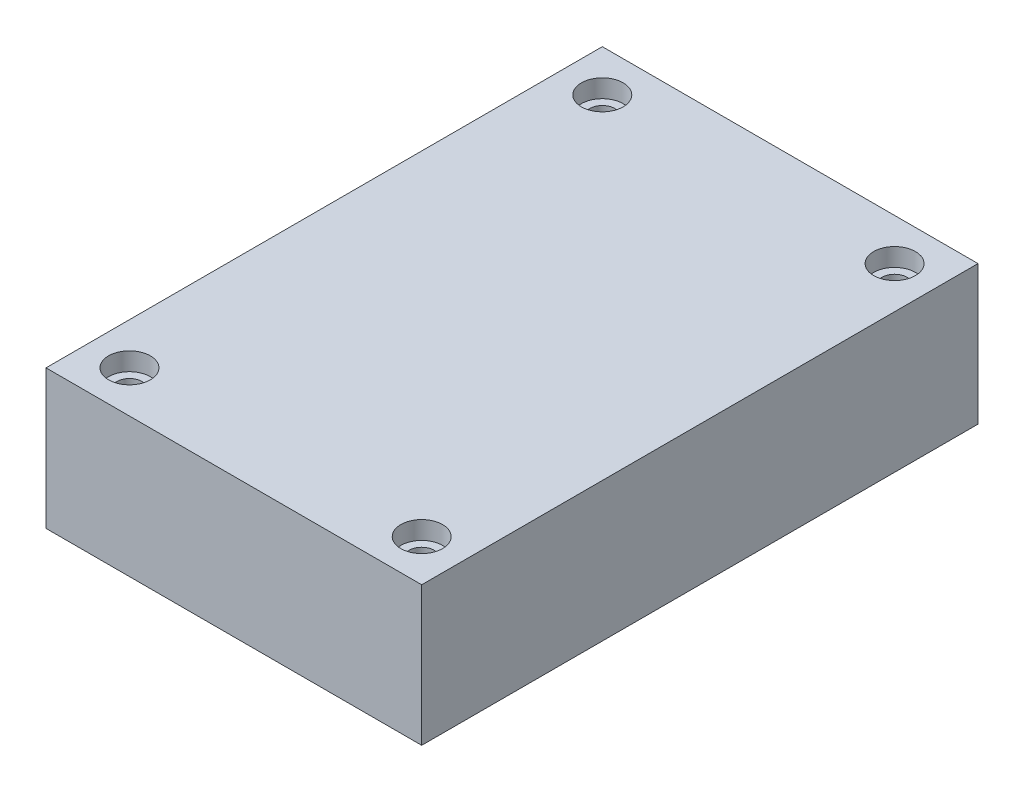
ISO-10303-21;
HEADER;
FILE_DESCRIPTION(('STEP AP214'),'2;1');
FILE_NAME('part.step','',(''),(''),'','','');
FILE_SCHEMA(('AUTOMOTIVE_DESIGN { 1 0 10303 214 1 1 1 1 }'));
ENDSEC;
DATA;
#1=APPLICATION_CONTEXT('core data for automotive mechanical design processes');
#2=APPLICATION_PROTOCOL_DEFINITION('international standard','automotive_design',2000,#1);
#3=PRODUCT_CONTEXT('',#1,'mechanical');
#4=PRODUCT('Part','Part','',(#3));
#5=PRODUCT_RELATED_PRODUCT_CATEGORY('part','',(#4));
#6=PRODUCT_DEFINITION_FORMATION('','',#4);
#7=PRODUCT_DEFINITION_CONTEXT('part definition',#1,'design');
#8=PRODUCT_DEFINITION('design','',#6,#7);
#9=PRODUCT_DEFINITION_SHAPE('','',#8);
#10=(LENGTH_UNIT() NAMED_UNIT(*) SI_UNIT(.MILLI.,.METRE.));
#11=(NAMED_UNIT(*) PLANE_ANGLE_UNIT() SI_UNIT($,.RADIAN.));
#12=(NAMED_UNIT(*) SI_UNIT($,.STERADIAN.) SOLID_ANGLE_UNIT());
#13=UNCERTAINTY_MEASURE_WITH_UNIT(LENGTH_MEASURE(1.E-05),#10,'distance_accuracy_value','');
#14=(GEOMETRIC_REPRESENTATION_CONTEXT(3) GLOBAL_UNCERTAINTY_ASSIGNED_CONTEXT((#13)) GLOBAL_UNIT_ASSIGNED_CONTEXT((#10,
#11,#12)) REPRESENTATION_CONTEXT('',''));
#15=CARTESIAN_POINT('',(0.,0.,0.));
#16=DIRECTION('',(0.,0.,1.));
#17=DIRECTION('',(1.,0.,0.));
#18=AXIS2_PLACEMENT_3D('',#15,#16,#17);
#19=CARTESIAN_POINT('',(67.5347222222222,-25.,200.));
#20=DIRECTION('',(0.,-1.,0.));
#21=DIRECTION('',(1.,0.,0.));
#22=AXIS2_PLACEMENT_3D('',#19,#20,#21);
#23=PLANE('',#22);
#24=CARTESIAN_POINT('',(-52.5347222222222,-25.,15.));
#25=DIRECTION('',(0.,1.,0.));
#26=DIRECTION('',(0.,0.,1.));
#27=AXIS2_PLACEMENT_3D('',#24,#25,#26);
#28=CIRCLE('',#27,4.49999999999999);
#29=CARTESIAN_POINT('',(-52.5347222222222,-25.,19.5));
#30=VERTEX_POINT('',#29);
#31=EDGE_CURVE('E121',#30,#30,#28,.T.);
#32=ORIENTED_EDGE('',*,*,#31,.T.);
#33=EDGE_LOOP('',(#32));
#34=FACE_BOUND('',#33,.T.);
#35=CARTESIAN_POINT('',(52.5347222222222,-25.,15.));
#36=DIRECTION('',(0.,1.,0.));
#37=DIRECTION('',(0.,0.,1.));
#38=AXIS2_PLACEMENT_3D('',#35,#36,#37);
#39=CIRCLE('',#38,4.49999999999999);
#40=CARTESIAN_POINT('',(52.5347222222222,-25.,19.5));
#41=VERTEX_POINT('',#40);
#42=EDGE_CURVE('E125',#41,#41,#39,.T.);
#43=ORIENTED_EDGE('',*,*,#42,.T.);
#44=EDGE_LOOP('',(#43));
#45=FACE_BOUND('',#44,.T.);
#46=CARTESIAN_POINT('',(52.5347222222222,-25.,185.));
#47=DIRECTION('',(0.,1.,0.));
#48=DIRECTION('',(0.,0.,1.));
#49=AXIS2_PLACEMENT_3D('',#46,#47,#48);
#50=CIRCLE('',#49,4.49999999999999);
#51=CARTESIAN_POINT('',(52.5347222222222,-25.,189.5));
#52=VERTEX_POINT('',#51);
#53=EDGE_CURVE('E129',#52,#52,#50,.T.);
#54=ORIENTED_EDGE('',*,*,#53,.T.);
#55=EDGE_LOOP('',(#54));
#56=FACE_BOUND('',#55,.T.);
#57=CARTESIAN_POINT('',(-52.5347222222222,-25.,185.));
#58=DIRECTION('',(0.,1.,0.));
#59=DIRECTION('',(0.,0.,1.));
#60=AXIS2_PLACEMENT_3D('',#57,#58,#59);
#61=CIRCLE('',#60,4.49999999999999);
#62=CARTESIAN_POINT('',(-52.5347222222222,-25.,189.5));
#63=VERTEX_POINT('',#62);
#64=EDGE_CURVE('E105',#63,#63,#61,.T.);
#65=ORIENTED_EDGE('',*,*,#64,.T.);
#66=EDGE_LOOP('',(#65));
#67=FACE_BOUND('',#66,.T.);
#68=DIRECTION('',(-1.,0.,0.));
#69=VECTOR('',#68,1.);
#70=CARTESIAN_POINT('',(67.5347222222222,-25.,0.));
#71=LINE('',#70,#69);
#72=CARTESIAN_POINT('',(67.5347222222222,-25.,0.));
#73=VERTEX_POINT('',#72);
#74=CARTESIAN_POINT('',(-67.5347222222222,-25.,0.));
#75=VERTEX_POINT('',#74);
#76=EDGE_CURVE('E101',#73,#75,#71,.T.);
#77=ORIENTED_EDGE('',*,*,#76,.F.);
#78=DIRECTION('',(0.,0.,-1.));
#79=VECTOR('',#78,1.);
#80=CARTESIAN_POINT('',(67.5347222222222,-25.,200.));
#81=LINE('',#80,#79);
#82=CARTESIAN_POINT('',(67.5347222222222,-25.,200.));
#83=VERTEX_POINT('',#82);
#84=EDGE_CURVE('E11',#83,#73,#81,.T.);
#85=ORIENTED_EDGE('',*,*,#84,.F.);
#86=DIRECTION('',(-1.,0.,0.));
#87=VECTOR('',#86,1.);
#88=CARTESIAN_POINT('',(67.5347222222222,-25.,200.));
#89=LINE('',#88,#87);
#90=CARTESIAN_POINT('',(-67.5347222222222,-25.,200.));
#91=VERTEX_POINT('',#90);
#92=EDGE_CURVE('E95',#83,#91,#89,.T.);
#93=ORIENTED_EDGE('',*,*,#92,.T.);
#94=DIRECTION('',(0.,0.,-1.));
#95=VECTOR('',#94,1.);
#96=CARTESIAN_POINT('',(-67.5347222222222,-25.,200.));
#97=LINE('',#96,#95);
#98=EDGE_CURVE('E38',#91,#75,#97,.T.);
#99=ORIENTED_EDGE('',*,*,#98,.T.);
#100=EDGE_LOOP('',(#77,#85,#93,#99));
#101=FACE_BOUND('',#100,.T.);
#102=ADVANCED_FACE('F35',(#34,#45,#56,#67,#101),#23,.T.);
#103=CARTESIAN_POINT('',(67.5347222222222,-25.,200.));
#104=DIRECTION('',(-1.,0.,0.));
#105=DIRECTION('',(0.,0.,1.));
#106=AXIS2_PLACEMENT_3D('',#103,#104,#105);
#107=PLANE('',#106);
#108=DIRECTION('',(0.,1.,0.));
#109=VECTOR('',#108,1.);
#110=CARTESIAN_POINT('',(67.5347222222222,-25.,0.));
#111=LINE('',#110,#109);
#112=CARTESIAN_POINT('',(67.5347222222222,25.,0.));
#113=VERTEX_POINT('',#112);
#114=EDGE_CURVE('E68',#73,#113,#111,.T.);
#115=ORIENTED_EDGE('',*,*,#114,.T.);
#116=DIRECTION('',(0.,0.,-1.));
#117=VECTOR('',#116,1.);
#118=CARTESIAN_POINT('',(67.5347222222222,25.,200.));
#119=LINE('',#118,#117);
#120=CARTESIAN_POINT('',(67.5347222222222,25.,200.));
#121=VERTEX_POINT('',#120);
#122=EDGE_CURVE('E44',#121,#113,#119,.T.);
#123=ORIENTED_EDGE('',*,*,#122,.F.);
#124=DIRECTION('',(0.,1.,0.));
#125=VECTOR('',#124,1.);
#126=CARTESIAN_POINT('',(67.5347222222222,-25.,200.));
#127=LINE('',#126,#125);
#128=EDGE_CURVE('E85',#83,#121,#127,.T.);
#129=ORIENTED_EDGE('',*,*,#128,.F.);
#130=ORIENTED_EDGE('',*,*,#84,.T.);
#131=EDGE_LOOP('',(#115,#123,#129,#130));
#132=FACE_BOUND('',#131,.T.);
#133=ADVANCED_FACE('F112',(#132),#107,.F.);
#134=CARTESIAN_POINT('',(67.5347222222222,25.,200.));
#135=DIRECTION('',(0.,-1.,0.));
#136=DIRECTION('',(1.,0.,0.));
#137=AXIS2_PLACEMENT_3D('',#134,#135,#136);
#138=PLANE('',#137);
#139=CARTESIAN_POINT('',(-52.5347222222222,25.,15.));
#140=DIRECTION('',(0.,1.,0.));
#141=DIRECTION('',(0.,0.,1.));
#142=AXIS2_PLACEMENT_3D('',#139,#140,#141);
#143=CIRCLE('',#142,7.49999999999999);
#144=CARTESIAN_POINT('',(-52.5347222222222,25.,22.5));
#145=VERTEX_POINT('',#144);
#146=EDGE_CURVE('E170',#145,#145,#143,.T.);
#147=ORIENTED_EDGE('',*,*,#146,.F.);
#148=EDGE_LOOP('',(#147));
#149=FACE_BOUND('',#148,.T.);
#150=CARTESIAN_POINT('',(52.5347222222222,25.,15.));
#151=DIRECTION('',(0.,1.,0.));
#152=DIRECTION('',(0.,0.,1.));
#153=AXIS2_PLACEMENT_3D('',#150,#151,#152);
#154=CIRCLE('',#153,7.49999999999999);
#155=CARTESIAN_POINT('',(52.5347222222222,25.,22.5));
#156=VERTEX_POINT('',#155);
#157=EDGE_CURVE('E160',#156,#156,#154,.T.);
#158=ORIENTED_EDGE('',*,*,#157,.F.);
#159=EDGE_LOOP('',(#158));
#160=FACE_BOUND('',#159,.T.);
#161=CARTESIAN_POINT('',(52.5347222222222,25.,185.));
#162=DIRECTION('',(0.,1.,0.));
#163=DIRECTION('',(0.,0.,1.));
#164=AXIS2_PLACEMENT_3D('',#161,#162,#163);
#165=CIRCLE('',#164,7.49999999999999);
#166=CARTESIAN_POINT('',(52.5347222222222,25.,192.5));
#167=VERTEX_POINT('',#166);
#168=EDGE_CURVE('E150',#167,#167,#165,.T.);
#169=ORIENTED_EDGE('',*,*,#168,.F.);
#170=EDGE_LOOP('',(#169));
#171=FACE_BOUND('',#170,.T.);
#172=CARTESIAN_POINT('',(-52.5347222222222,25.,185.));
#173=DIRECTION('',(0.,1.,0.));
#174=DIRECTION('',(0.,0.,1.));
#175=AXIS2_PLACEMENT_3D('',#172,#173,#174);
#176=CIRCLE('',#175,7.49999999999999);
#177=CARTESIAN_POINT('',(-52.5347222222222,25.,192.5));
#178=VERTEX_POINT('',#177);
#179=EDGE_CURVE('E140',#178,#178,#176,.T.);
#180=ORIENTED_EDGE('',*,*,#179,.F.);
#181=EDGE_LOOP('',(#180));
#182=FACE_BOUND('',#181,.T.);
#183=DIRECTION('',(-1.,0.,0.));
#184=VECTOR('',#183,1.);
#185=CARTESIAN_POINT('',(67.5347222222222,25.,0.));
#186=LINE('',#185,#184);
#187=CARTESIAN_POINT('',(-67.5347222222222,25.,0.));
#188=VERTEX_POINT('',#187);
#189=EDGE_CURVE('E92',#113,#188,#186,.T.);
#190=ORIENTED_EDGE('',*,*,#189,.T.);
#191=DIRECTION('',(0.,0.,-1.));
#192=VECTOR('',#191,1.);
#193=CARTESIAN_POINT('',(-67.5347222222222,25.,200.));
#194=LINE('',#193,#192);
#195=CARTESIAN_POINT('',(-67.5347222222222,25.,200.));
#196=VERTEX_POINT('',#195);
#197=EDGE_CURVE('E89',#196,#188,#194,.T.);
#198=ORIENTED_EDGE('',*,*,#197,.F.);
#199=DIRECTION('',(-1.,0.,0.));
#200=VECTOR('',#199,1.);
#201=CARTESIAN_POINT('',(67.5347222222222,25.,200.));
#202=LINE('',#201,#200);
#203=EDGE_CURVE('E80',#121,#196,#202,.T.);
#204=ORIENTED_EDGE('',*,*,#203,.F.);
#205=ORIENTED_EDGE('',*,*,#122,.T.);
#206=EDGE_LOOP('',(#190,#198,#204,#205));
#207=FACE_BOUND('',#206,.T.);
#208=ADVANCED_FACE('F90',(#149,#160,#171,#182,#207),#138,.F.);
#209=CARTESIAN_POINT('',(-67.5347222222222,-25.,200.));
#210=DIRECTION('',(-1.,0.,0.));
#211=DIRECTION('',(0.,0.,1.));
#212=AXIS2_PLACEMENT_3D('',#209,#210,#211);
#213=PLANE('',#212);
#214=DIRECTION('',(0.,1.,0.));
#215=VECTOR('',#214,1.);
#216=CARTESIAN_POINT('',(-67.5347222222222,-25.,0.));
#217=LINE('',#216,#215);
#218=EDGE_CURVE('E104',#75,#188,#217,.T.);
#219=ORIENTED_EDGE('',*,*,#218,.F.);
#220=ORIENTED_EDGE('',*,*,#98,.F.);
#221=DIRECTION('',(0.,1.,0.));
#222=VECTOR('',#221,1.);
#223=CARTESIAN_POINT('',(-67.5347222222222,-25.,200.));
#224=LINE('',#223,#222);
#225=EDGE_CURVE('E84',#91,#196,#224,.T.);
#226=ORIENTED_EDGE('',*,*,#225,.T.);
#227=ORIENTED_EDGE('',*,*,#197,.T.);
#228=EDGE_LOOP('',(#219,#220,#226,#227));
#229=FACE_BOUND('',#228,.T.);
#230=ADVANCED_FACE('F94',(#229),#213,.T.);
#231=CARTESIAN_POINT('',(0.,0.,200.));
#232=DIRECTION('',(0.,0.,-1.));
#233=DIRECTION('',(-1.,0.,0.));
#234=AXIS2_PLACEMENT_3D('',#231,#232,#233);
#235=PLANE('',#234);
#236=ORIENTED_EDGE('',*,*,#92,.F.);
#237=ORIENTED_EDGE('',*,*,#128,.T.);
#238=ORIENTED_EDGE('',*,*,#203,.T.);
#239=ORIENTED_EDGE('',*,*,#225,.F.);
#240=EDGE_LOOP('',(#236,#237,#238,#239));
#241=FACE_BOUND('',#240,.T.);
#242=ADVANCED_FACE('F83',(#241),#235,.F.);
#243=CARTESIAN_POINT('',(0.,0.,0.));
#244=DIRECTION('',(0.,0.,-1.));
#245=DIRECTION('',(-1.,0.,0.));
#246=AXIS2_PLACEMENT_3D('',#243,#244,#245);
#247=PLANE('',#246);
#248=ORIENTED_EDGE('',*,*,#76,.T.);
#249=ORIENTED_EDGE('',*,*,#218,.T.);
#250=ORIENTED_EDGE('',*,*,#189,.F.);
#251=ORIENTED_EDGE('',*,*,#114,.F.);
#252=EDGE_LOOP('',(#248,#249,#250,#251));
#253=FACE_BOUND('',#252,.T.);
#254=ADVANCED_FACE('F110',(#253),#247,.T.);
#255=CARTESIAN_POINT('',(-52.5347222222222,25.,185.));
#256=DIRECTION('',(0.,1.,0.));
#257=DIRECTION('',(0.,0.,1.));
#258=AXIS2_PLACEMENT_3D('',#255,#256,#257);
#259=CYLINDRICAL_SURFACE('',#258,4.5);
#260=ORIENTED_EDGE('',*,*,#64,.F.);
#261=EDGE_LOOP('',(#260));
#262=FACE_BOUND('',#261,.T.);
#263=CARTESIAN_POINT('',(-52.5347222222222,18.5,185.));
#264=DIRECTION('',(0.,1.,0.));
#265=DIRECTION('',(0.,0.,1.));
#266=AXIS2_PLACEMENT_3D('',#263,#264,#265);
#267=CIRCLE('',#266,4.5);
#268=CARTESIAN_POINT('',(-52.5347222222222,18.5,189.5));
#269=VERTEX_POINT('',#268);
#270=EDGE_CURVE('E133',#269,#269,#267,.T.);
#271=ORIENTED_EDGE('',*,*,#270,.T.);
#272=EDGE_LOOP('',(#271));
#273=FACE_BOUND('',#272,.T.);
#274=ADVANCED_FACE('F198',(#262,#273),#259,.F.);
#275=CARTESIAN_POINT('',(-48.0347222222222,18.5,185.));
#276=DIRECTION('',(0.,-1.,0.));
#277=DIRECTION('',(0.,0.,-1.));
#278=AXIS2_PLACEMENT_3D('',#275,#276,#277);
#279=PLANE('',#278);
#280=ORIENTED_EDGE('',*,*,#270,.F.);
#281=EDGE_LOOP('',(#280));
#282=FACE_BOUND('',#281,.T.);
#283=CARTESIAN_POINT('',(-52.5347222222222,18.5,185.));
#284=DIRECTION('',(0.,1.,0.));
#285=DIRECTION('',(0.,0.,1.));
#286=AXIS2_PLACEMENT_3D('',#283,#284,#285);
#287=CIRCLE('',#286,7.49999999999999);
#288=CARTESIAN_POINT('',(-52.5347222222222,18.5,192.5));
#289=VERTEX_POINT('',#288);
#290=EDGE_CURVE('E135',#289,#289,#287,.T.);
#291=ORIENTED_EDGE('',*,*,#290,.T.);
#292=EDGE_LOOP('',(#291));
#293=FACE_BOUND('',#292,.T.);
#294=ADVANCED_FACE('F188',(#282,#293),#279,.F.);
#295=CARTESIAN_POINT('',(-52.5347222222222,25.,185.));
#296=DIRECTION('',(0.,1.,0.));
#297=DIRECTION('',(0.,0.,1.));
#298=AXIS2_PLACEMENT_3D('',#295,#296,#297);
#299=CYLINDRICAL_SURFACE('',#298,7.49999999999999);
#300=ORIENTED_EDGE('',*,*,#290,.F.);
#301=EDGE_LOOP('',(#300));
#302=FACE_BOUND('',#301,.T.);
#303=ORIENTED_EDGE('',*,*,#179,.T.);
#304=EDGE_LOOP('',(#303));
#305=FACE_BOUND('',#304,.T.);
#306=ADVANCED_FACE('F185',(#302,#305),#299,.F.);
#307=CARTESIAN_POINT('',(52.5347222222222,25.,185.));
#308=DIRECTION('',(0.,1.,0.));
#309=DIRECTION('',(0.,0.,1.));
#310=AXIS2_PLACEMENT_3D('',#307,#308,#309);
#311=CYLINDRICAL_SURFACE('',#310,4.5);
#312=ORIENTED_EDGE('',*,*,#53,.F.);
#313=EDGE_LOOP('',(#312));
#314=FACE_BOUND('',#313,.T.);
#315=CARTESIAN_POINT('',(52.5347222222222,18.5,185.));
#316=DIRECTION('',(0.,1.,0.));
#317=DIRECTION('',(0.,0.,1.));
#318=AXIS2_PLACEMENT_3D('',#315,#316,#317);
#319=CIRCLE('',#318,4.5);
#320=CARTESIAN_POINT('',(52.5347222222222,18.5,189.5));
#321=VERTEX_POINT('',#320);
#322=EDGE_CURVE('E144',#321,#321,#319,.T.);
#323=ORIENTED_EDGE('',*,*,#322,.T.);
#324=EDGE_LOOP('',(#323));
#325=FACE_BOUND('',#324,.T.);
#326=ADVANCED_FACE('F187',(#314,#325),#311,.F.);
#327=CARTESIAN_POINT('',(57.0347222222222,18.5,185.));
#328=DIRECTION('',(0.,-1.,0.));
#329=DIRECTION('',(0.,0.,-1.));
#330=AXIS2_PLACEMENT_3D('',#327,#328,#329);
#331=PLANE('',#330);
#332=ORIENTED_EDGE('',*,*,#322,.F.);
#333=EDGE_LOOP('',(#332));
#334=FACE_BOUND('',#333,.T.);
#335=CARTESIAN_POINT('',(52.5347222222222,18.5,185.));
#336=DIRECTION('',(0.,1.,0.));
#337=DIRECTION('',(0.,0.,1.));
#338=AXIS2_PLACEMENT_3D('',#335,#336,#337);
#339=CIRCLE('',#338,7.49999999999999);
#340=CARTESIAN_POINT('',(52.5347222222222,18.5,192.5));
#341=VERTEX_POINT('',#340);
#342=EDGE_CURVE('E147',#341,#341,#339,.T.);
#343=ORIENTED_EDGE('',*,*,#342,.T.);
#344=EDGE_LOOP('',(#343));
#345=FACE_BOUND('',#344,.T.);
#346=ADVANCED_FACE('F195',(#334,#345),#331,.F.);
#347=CARTESIAN_POINT('',(52.5347222222222,25.,185.));
#348=DIRECTION('',(0.,1.,0.));
#349=DIRECTION('',(0.,0.,1.));
#350=AXIS2_PLACEMENT_3D('',#347,#348,#349);
#351=CYLINDRICAL_SURFACE('',#350,7.49999999999999);
#352=ORIENTED_EDGE('',*,*,#342,.F.);
#353=EDGE_LOOP('',(#352));
#354=FACE_BOUND('',#353,.T.);
#355=ORIENTED_EDGE('',*,*,#168,.T.);
#356=EDGE_LOOP('',(#355));
#357=FACE_BOUND('',#356,.T.);
#358=ADVANCED_FACE('F250',(#354,#357),#351,.F.);
#359=CARTESIAN_POINT('',(52.5347222222222,25.,15.));
#360=DIRECTION('',(0.,1.,0.));
#361=DIRECTION('',(0.,0.,1.));
#362=AXIS2_PLACEMENT_3D('',#359,#360,#361);
#363=CYLINDRICAL_SURFACE('',#362,4.5);
#364=ORIENTED_EDGE('',*,*,#42,.F.);
#365=EDGE_LOOP('',(#364));
#366=FACE_BOUND('',#365,.T.);
#367=CARTESIAN_POINT('',(52.5347222222222,18.5,15.));
#368=DIRECTION('',(0.,1.,0.));
#369=DIRECTION('',(0.,0.,1.));
#370=AXIS2_PLACEMENT_3D('',#367,#368,#369);
#371=CIRCLE('',#370,4.5);
#372=CARTESIAN_POINT('',(52.5347222222222,18.5,19.5));
#373=VERTEX_POINT('',#372);
#374=EDGE_CURVE('E154',#373,#373,#371,.T.);
#375=ORIENTED_EDGE('',*,*,#374,.T.);
#376=EDGE_LOOP('',(#375));
#377=FACE_BOUND('',#376,.T.);
#378=ADVANCED_FACE('F258',(#366,#377),#363,.F.);
#379=CARTESIAN_POINT('',(57.0347222222222,18.5,15.));
#380=DIRECTION('',(0.,-1.,0.));
#381=DIRECTION('',(0.,0.,-1.));
#382=AXIS2_PLACEMENT_3D('',#379,#380,#381);
#383=PLANE('',#382);
#384=ORIENTED_EDGE('',*,*,#374,.F.);
#385=EDGE_LOOP('',(#384));
#386=FACE_BOUND('',#385,.T.);
#387=CARTESIAN_POINT('',(52.5347222222222,18.5,15.));
#388=DIRECTION('',(0.,1.,0.));
#389=DIRECTION('',(0.,0.,1.));
#390=AXIS2_PLACEMENT_3D('',#387,#388,#389);
#391=CIRCLE('',#390,7.49999999999999);
#392=CARTESIAN_POINT('',(52.5347222222222,18.5,22.5));
#393=VERTEX_POINT('',#392);
#394=EDGE_CURVE('E157',#393,#393,#391,.T.);
#395=ORIENTED_EDGE('',*,*,#394,.T.);
#396=EDGE_LOOP('',(#395));
#397=FACE_BOUND('',#396,.T.);
#398=ADVANCED_FACE('F278',(#386,#397),#383,.F.);
#399=CARTESIAN_POINT('',(52.5347222222222,25.,15.));
#400=DIRECTION('',(0.,1.,0.));
#401=DIRECTION('',(0.,0.,1.));
#402=AXIS2_PLACEMENT_3D('',#399,#400,#401);
#403=CYLINDRICAL_SURFACE('',#402,7.49999999999999);
#404=ORIENTED_EDGE('',*,*,#394,.F.);
#405=EDGE_LOOP('',(#404));
#406=FACE_BOUND('',#405,.T.);
#407=ORIENTED_EDGE('',*,*,#157,.T.);
#408=EDGE_LOOP('',(#407));
#409=FACE_BOUND('',#408,.T.);
#410=ADVANCED_FACE('F288',(#406,#409),#403,.F.);
#411=CARTESIAN_POINT('',(-52.5347222222222,25.,15.));
#412=DIRECTION('',(0.,1.,0.));
#413=DIRECTION('',(0.,0.,1.));
#414=AXIS2_PLACEMENT_3D('',#411,#412,#413);
#415=CYLINDRICAL_SURFACE('',#414,4.5);
#416=ORIENTED_EDGE('',*,*,#31,.F.);
#417=EDGE_LOOP('',(#416));
#418=FACE_BOUND('',#417,.T.);
#419=CARTESIAN_POINT('',(-52.5347222222222,18.5,15.));
#420=DIRECTION('',(0.,1.,0.));
#421=DIRECTION('',(0.,0.,1.));
#422=AXIS2_PLACEMENT_3D('',#419,#420,#421);
#423=CIRCLE('',#422,4.5);
#424=CARTESIAN_POINT('',(-52.5347222222222,18.5,19.5));
#425=VERTEX_POINT('',#424);
#426=EDGE_CURVE('E164',#425,#425,#423,.T.);
#427=ORIENTED_EDGE('',*,*,#426,.T.);
#428=EDGE_LOOP('',(#427));
#429=FACE_BOUND('',#428,.T.);
#430=ADVANCED_FACE('F298',(#418,#429),#415,.F.);
#431=CARTESIAN_POINT('',(-48.0347222222222,18.5,15.));
#432=DIRECTION('',(0.,-1.,0.));
#433=DIRECTION('',(0.,0.,-1.));
#434=AXIS2_PLACEMENT_3D('',#431,#432,#433);
#435=PLANE('',#434);
#436=ORIENTED_EDGE('',*,*,#426,.F.);
#437=EDGE_LOOP('',(#436));
#438=FACE_BOUND('',#437,.T.);
#439=CARTESIAN_POINT('',(-52.5347222222222,18.5,15.));
#440=DIRECTION('',(0.,1.,0.));
#441=DIRECTION('',(0.,0.,1.));
#442=AXIS2_PLACEMENT_3D('',#439,#440,#441);
#443=CIRCLE('',#442,7.49999999999999);
#444=CARTESIAN_POINT('',(-52.5347222222222,18.5,22.5));
#445=VERTEX_POINT('',#444);
#446=EDGE_CURVE('E167',#445,#445,#443,.T.);
#447=ORIENTED_EDGE('',*,*,#446,.T.);
#448=EDGE_LOOP('',(#447));
#449=FACE_BOUND('',#448,.T.);
#450=ADVANCED_FACE('F308',(#438,#449),#435,.F.);
#451=CARTESIAN_POINT('',(-52.5347222222222,25.,15.));
#452=DIRECTION('',(0.,1.,0.));
#453=DIRECTION('',(0.,0.,1.));
#454=AXIS2_PLACEMENT_3D('',#451,#452,#453);
#455=CYLINDRICAL_SURFACE('',#454,7.49999999999999);
#456=ORIENTED_EDGE('',*,*,#446,.F.);
#457=EDGE_LOOP('',(#456));
#458=FACE_BOUND('',#457,.T.);
#459=ORIENTED_EDGE('',*,*,#146,.T.);
#460=EDGE_LOOP('',(#459));
#461=FACE_BOUND('',#460,.T.);
#462=ADVANCED_FACE('F174',(#458,#461),#455,.F.);
#463=CLOSED_SHELL('',(#102,#133,#208,#230,#242,#254,#274,#294,#306,#326,#346,#358,#378,#398,
#410,#430,#450,#462));
#464=MANIFOLD_SOLID_BREP('B2',#463);
#465=ADVANCED_BREP_SHAPE_REPRESENTATION('',(#18,#464),#14);
#466=SHAPE_DEFINITION_REPRESENTATION(#9,#465);
ENDSEC;
END-ISO-10303-21;
